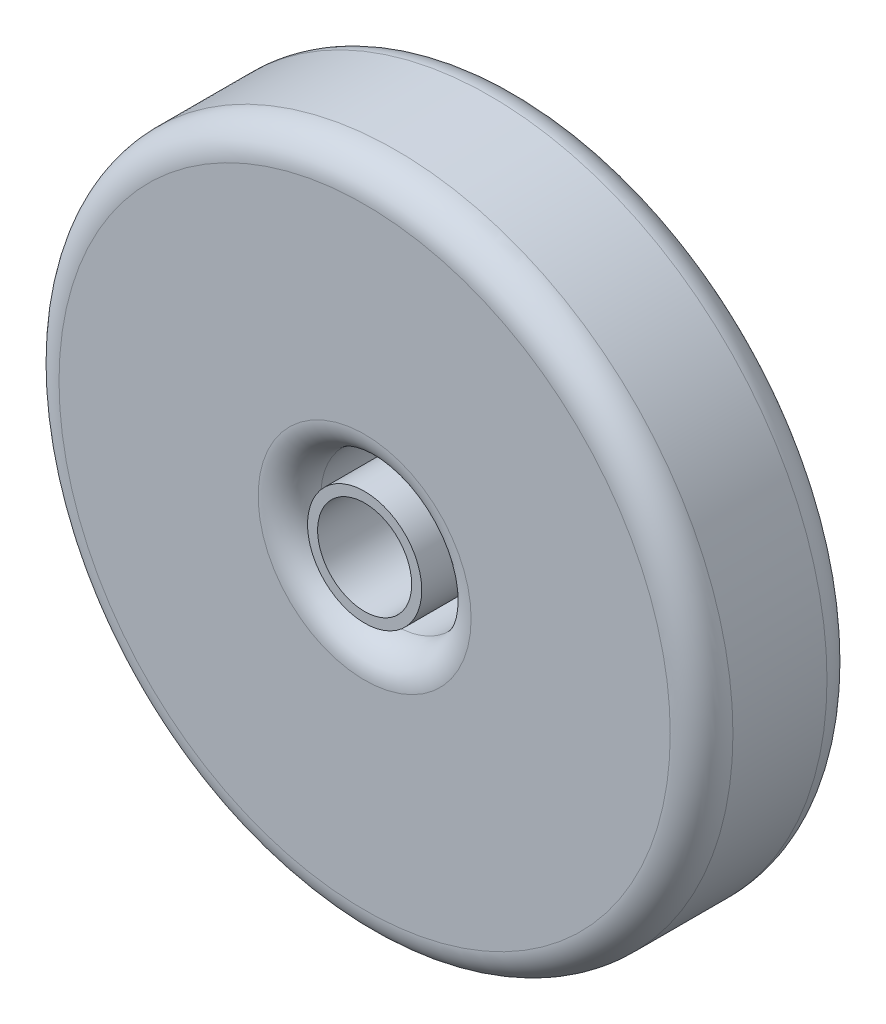
ISO-10303-21;
HEADER;
FILE_DESCRIPTION(('STEP AP214'),'2;1');
FILE_NAME('part.step','',(''),(''),'','','');
FILE_SCHEMA(('AUTOMOTIVE_DESIGN { 1 0 10303 214 1 1 1 1 }'));
ENDSEC;
DATA;
#1=APPLICATION_CONTEXT('core data for automotive mechanical design processes');
#2=APPLICATION_PROTOCOL_DEFINITION('international standard','automotive_design',2000,#1);
#3=PRODUCT_CONTEXT('',#1,'mechanical');
#4=PRODUCT('Part','Part','',(#3));
#5=PRODUCT_RELATED_PRODUCT_CATEGORY('part','',(#4));
#6=PRODUCT_DEFINITION_FORMATION('','',#4);
#7=PRODUCT_DEFINITION_CONTEXT('part definition',#1,'design');
#8=PRODUCT_DEFINITION('design','',#6,#7);
#9=PRODUCT_DEFINITION_SHAPE('','',#8);
#10=(LENGTH_UNIT() NAMED_UNIT(*) SI_UNIT(.MILLI.,.METRE.));
#11=(NAMED_UNIT(*) PLANE_ANGLE_UNIT() SI_UNIT($,.RADIAN.));
#12=(NAMED_UNIT(*) SI_UNIT($,.STERADIAN.) SOLID_ANGLE_UNIT());
#13=UNCERTAINTY_MEASURE_WITH_UNIT(LENGTH_MEASURE(1.E-05),#10,'distance_accuracy_value','');
#14=(GEOMETRIC_REPRESENTATION_CONTEXT(3) GLOBAL_UNCERTAINTY_ASSIGNED_CONTEXT((#13)) GLOBAL_UNIT_ASSIGNED_CONTEXT((#10,
#11,#12)) REPRESENTATION_CONTEXT('',''));
#15=CARTESIAN_POINT('',(0.,0.,0.));
#16=DIRECTION('',(0.,0.,1.));
#17=DIRECTION('',(1.,0.,0.));
#18=AXIS2_PLACEMENT_3D('',#15,#16,#17);
#19=CARTESIAN_POINT('',(0.,0.,12.7));
#20=DIRECTION('',(0.,0.,1.));
#21=DIRECTION('',(1.,0.,0.));
#22=AXIS2_PLACEMENT_3D('',#19,#20,#21);
#23=PLANE('',#22);
#24=CARTESIAN_POINT('',(0.,0.,12.7));
#25=DIRECTION('',(0.,0.,1.));
#26=DIRECTION('',(1.,0.,0.));
#27=AXIS2_PLACEMENT_3D('',#24,#25,#26);
#28=CIRCLE('',#27,3.81);
#29=CARTESIAN_POINT('',(3.81,0.,12.7));
#30=VERTEX_POINT('',#29);
#31=EDGE_CURVE('E59',#30,#30,#28,.T.);
#32=ORIENTED_EDGE('',*,*,#31,.F.);
#33=EDGE_LOOP('',(#32));
#34=FACE_BOUND('',#33,.T.);
#35=CARTESIAN_POINT('',(0.,0.,12.7));
#36=DIRECTION('',(0.,0.,1.));
#37=DIRECTION('',(1.,0.,0.));
#38=AXIS2_PLACEMENT_3D('',#35,#36,#37);
#39=CIRCLE('',#38,4.62641066791243);
#40=CARTESIAN_POINT('',(4.62641066791243,0.,12.7));
#41=VERTEX_POINT('',#40);
#42=EDGE_CURVE('E69',#41,#41,#39,.T.);
#43=ORIENTED_EDGE('',*,*,#42,.T.);
#44=EDGE_LOOP('',(#43));
#45=FACE_BOUND('',#44,.T.);
#46=ADVANCED_FACE('F33',(#34,#45),#23,.T.);
#47=CARTESIAN_POINT('',(0.,0.,12.7));
#48=DIRECTION('',(0.,0.,1.));
#49=DIRECTION('',(1.,0.,0.));
#50=AXIS2_PLACEMENT_3D('',#47,#48,#49);
#51=CIRCLE('',#50,8.62919775823932);
#52=CARTESIAN_POINT('',(8.62919775823932,0.,12.7));
#53=VERTEX_POINT('',#52);
#54=EDGE_CURVE('E48',#53,#53,#51,.F.);
#55=ORIENTED_EDGE('',*,*,#54,.T.);
#56=EDGE_LOOP('',(#55));
#57=FACE_BOUND('',#56,.T.);
#58=CARTESIAN_POINT('',(0.,0.,12.7));
#59=DIRECTION('',(0.,0.,1.));
#60=DIRECTION('',(1.,0.,0.));
#61=AXIS2_PLACEMENT_3D('',#58,#59,#60);
#62=CIRCLE('',#61,24.765);
#63=CARTESIAN_POINT('',(24.765,0.,12.7));
#64=VERTEX_POINT('',#63);
#65=EDGE_CURVE('E53',#64,#64,#62,.T.);
#66=ORIENTED_EDGE('',*,*,#65,.T.);
#67=EDGE_LOOP('',(#66));
#68=FACE_BOUND('',#67,.T.);
#69=ADVANCED_FACE('F96',(#57,#68),#23,.T.);
#70=CARTESIAN_POINT('',(0.,0.,0.));
#71=DIRECTION('',(0.,0.,1.));
#72=DIRECTION('',(1.,0.,0.));
#73=AXIS2_PLACEMENT_3D('',#70,#71,#72);
#74=PLANE('',#73);
#75=CARTESIAN_POINT('',(0.,0.,0.));
#76=DIRECTION('',(0.,0.,1.));
#77=DIRECTION('',(1.,0.,0.));
#78=AXIS2_PLACEMENT_3D('',#75,#76,#77);
#79=CIRCLE('',#78,24.765);
#80=CARTESIAN_POINT('',(24.765,0.,0.));
#81=VERTEX_POINT('',#80);
#82=EDGE_CURVE('E10',#81,#81,#79,.F.);
#83=ORIENTED_EDGE('',*,*,#82,.T.);
#84=EDGE_LOOP('',(#83));
#85=FACE_BOUND('',#84,.T.);
#86=CARTESIAN_POINT('',(0.,0.,0.));
#87=DIRECTION('',(0.,0.,1.));
#88=DIRECTION('',(1.,0.,0.));
#89=AXIS2_PLACEMENT_3D('',#86,#87,#88);
#90=CIRCLE('',#89,3.81);
#91=CARTESIAN_POINT('',(3.81,0.,0.));
#92=VERTEX_POINT('',#91);
#93=EDGE_CURVE('E60',#92,#92,#90,.T.);
#94=ORIENTED_EDGE('',*,*,#93,.T.);
#95=EDGE_LOOP('',(#94));
#96=FACE_BOUND('',#95,.T.);
#97=ADVANCED_FACE('F102',(#85,#96),#74,.F.);
#98=CARTESIAN_POINT('',(0.,0.,12.7));
#99=DIRECTION('',(0.,0.,-1.));
#100=DIRECTION('',(-1.,0.,0.));
#101=AXIS2_PLACEMENT_3D('',#98,#99,#100);
#102=CYLINDRICAL_SURFACE('',#101,27.305);
#103=CARTESIAN_POINT('',(0.,0.,2.54));
#104=DIRECTION('',(0.,0.,1.));
#105=DIRECTION('',(1.,0.,0.));
#106=AXIS2_PLACEMENT_3D('',#103,#104,#105);
#107=CIRCLE('',#106,27.305);
#108=CARTESIAN_POINT('',(27.305,0.,2.54));
#109=VERTEX_POINT('',#108);
#110=EDGE_CURVE('E40',#109,#109,#107,.T.);
#111=ORIENTED_EDGE('',*,*,#110,.T.);
#112=EDGE_LOOP('',(#111));
#113=FACE_BOUND('',#112,.T.);
#114=CARTESIAN_POINT('',(0.,0.,10.16));
#115=DIRECTION('',(0.,0.,1.));
#116=DIRECTION('',(1.,0.,0.));
#117=AXIS2_PLACEMENT_3D('',#114,#115,#116);
#118=CIRCLE('',#117,27.305);
#119=CARTESIAN_POINT('',(27.305,0.,10.16));
#120=VERTEX_POINT('',#119);
#121=EDGE_CURVE('E44',#120,#120,#118,.F.);
#122=ORIENTED_EDGE('',*,*,#121,.T.);
#123=EDGE_LOOP('',(#122));
#124=FACE_BOUND('',#123,.T.);
#125=ADVANCED_FACE('F92',(#113,#124),#102,.T.);
#126=CARTESIAN_POINT('',(0.,0.,12.7));
#127=DIRECTION('',(0.,0.,-1.));
#128=DIRECTION('',(-1.,0.,0.));
#129=AXIS2_PLACEMENT_3D('',#126,#127,#128);
#130=CYLINDRICAL_SURFACE('',#129,3.81);
#131=ORIENTED_EDGE('',*,*,#31,.T.);
#132=EDGE_LOOP('',(#131));
#133=FACE_BOUND('',#132,.T.);
#134=ORIENTED_EDGE('',*,*,#93,.F.);
#135=EDGE_LOOP('',(#134));
#136=FACE_BOUND('',#135,.T.);
#137=ADVANCED_FACE('F86',(#133,#136),#130,.F.);
#138=CARTESIAN_POINT('',(0.,0.,2.54));
#139=DIRECTION('',(0.,0.,1.));
#140=DIRECTION('',(1.,0.,0.));
#141=AXIS2_PLACEMENT_3D('',#138,#139,#140);
#142=CYLINDRICAL_SURFACE('',#141,6.08919775823932);
#143=CARTESIAN_POINT('',(0.,0.,10.16));
#144=DIRECTION('',(0.,0.,1.));
#145=DIRECTION('',(1.,0.,0.));
#146=AXIS2_PLACEMENT_3D('',#143,#144,#145);
#147=CIRCLE('',#146,6.08919775823932);
#148=CARTESIAN_POINT('',(6.08919775823932,0.,10.16));
#149=VERTEX_POINT('',#148);
#150=EDGE_CURVE('E56',#149,#149,#147,.T.);
#151=ORIENTED_EDGE('',*,*,#150,.T.);
#152=EDGE_LOOP('',(#151));
#153=FACE_BOUND('',#152,.T.);
#154=CARTESIAN_POINT('',(0.,0.,2.54));
#155=DIRECTION('',(0.,0.,1.));
#156=DIRECTION('',(1.,0.,0.));
#157=AXIS2_PLACEMENT_3D('',#154,#155,#156);
#158=CIRCLE('',#157,6.08919775823932);
#159=CARTESIAN_POINT('',(6.08919775823932,0.,2.54));
#160=VERTEX_POINT('',#159);
#161=EDGE_CURVE('E63',#160,#160,#158,.T.);
#162=ORIENTED_EDGE('',*,*,#161,.F.);
#163=EDGE_LOOP('',(#162));
#164=FACE_BOUND('',#163,.T.);
#165=ADVANCED_FACE('F81',(#153,#164),#142,.F.);
#166=CARTESIAN_POINT('',(0.,0.,2.54));
#167=DIRECTION('',(0.,0.,1.));
#168=DIRECTION('',(1.,0.,0.));
#169=AXIS2_PLACEMENT_3D('',#166,#167,#168);
#170=PLANE('',#169);
#171=CARTESIAN_POINT('',(0.,0.,2.54));
#172=DIRECTION('',(0.,0.,1.));
#173=DIRECTION('',(1.,0.,0.));
#174=AXIS2_PLACEMENT_3D('',#171,#172,#173);
#175=CIRCLE('',#174,4.62641066791243);
#176=CARTESIAN_POINT('',(4.62641066791243,0.,2.54));
#177=VERTEX_POINT('',#176);
#178=EDGE_CURVE('E68',#177,#177,#175,.T.);
#179=ORIENTED_EDGE('',*,*,#178,.F.);
#180=EDGE_LOOP('',(#179));
#181=FACE_BOUND('',#180,.T.);
#182=ORIENTED_EDGE('',*,*,#161,.T.);
#183=EDGE_LOOP('',(#182));
#184=FACE_BOUND('',#183,.T.);
#185=ADVANCED_FACE('F78',(#181,#184),#170,.T.);
#186=CARTESIAN_POINT('',(0.,0.,2.54));
#187=DIRECTION('',(0.,0.,1.));
#188=DIRECTION('',(1.,0.,0.));
#189=AXIS2_PLACEMENT_3D('',#186,#187,#188);
#190=CYLINDRICAL_SURFACE('',#189,4.62641066791243);
#191=ORIENTED_EDGE('',*,*,#178,.T.);
#192=EDGE_LOOP('',(#191));
#193=FACE_BOUND('',#192,.T.);
#194=ORIENTED_EDGE('',*,*,#42,.F.);
#195=EDGE_LOOP('',(#194));
#196=FACE_BOUND('',#195,.T.);
#197=ADVANCED_FACE('F75',(#193,#196),#190,.T.);
#198=CARTESIAN_POINT('',(0.,0.,10.16));
#199=DIRECTION('',(0.,0.,1.));
#200=DIRECTION('',(1.,0.,0.));
#201=AXIS2_PLACEMENT_3D('',#198,#199,#200);
#202=TOROIDAL_SURFACE('',#201,8.62919775823932,2.54);
#203=ORIENTED_EDGE('',*,*,#54,.F.);
#204=EDGE_LOOP('',(#203));
#205=FACE_BOUND('',#204,.T.);
#206=ORIENTED_EDGE('',*,*,#150,.F.);
#207=EDGE_LOOP('',(#206));
#208=FACE_BOUND('',#207,.T.);
#209=ADVANCED_FACE('F111',(#205,#208),#202,.T.);
#210=CARTESIAN_POINT('',(0.,0.,10.16));
#211=DIRECTION('',(0.,0.,1.));
#212=DIRECTION('',(1.,0.,0.));
#213=AXIS2_PLACEMENT_3D('',#210,#211,#212);
#214=TOROIDAL_SURFACE('',#213,24.765,2.54);
#215=ORIENTED_EDGE('',*,*,#121,.F.);
#216=EDGE_LOOP('',(#215));
#217=FACE_BOUND('',#216,.T.);
#218=ORIENTED_EDGE('',*,*,#65,.F.);
#219=EDGE_LOOP('',(#218));
#220=FACE_BOUND('',#219,.T.);
#221=ADVANCED_FACE('F113',(#217,#220),#214,.T.);
#222=CARTESIAN_POINT('',(0.,0.,2.54));
#223=DIRECTION('',(0.,0.,1.));
#224=DIRECTION('',(1.,0.,0.));
#225=AXIS2_PLACEMENT_3D('',#222,#223,#224);
#226=TOROIDAL_SURFACE('',#225,24.765,2.54);
#227=ORIENTED_EDGE('',*,*,#82,.F.);
#228=EDGE_LOOP('',(#227));
#229=FACE_BOUND('',#228,.T.);
#230=ORIENTED_EDGE('',*,*,#110,.F.);
#231=EDGE_LOOP('',(#230));
#232=FACE_BOUND('',#231,.T.);
#233=ADVANCED_FACE('F35',(#229,#232),#226,.T.);
#234=CLOSED_SHELL('',(#46,#69,#97,#125,#137,#165,#185,#197,#209,#221,#233));
#235=MANIFOLD_SOLID_BREP('B2',#234);
#236=ADVANCED_BREP_SHAPE_REPRESENTATION('',(#18,#235),#14);
#237=SHAPE_DEFINITION_REPRESENTATION(#9,#236);
ENDSEC;
END-ISO-10303-21;
